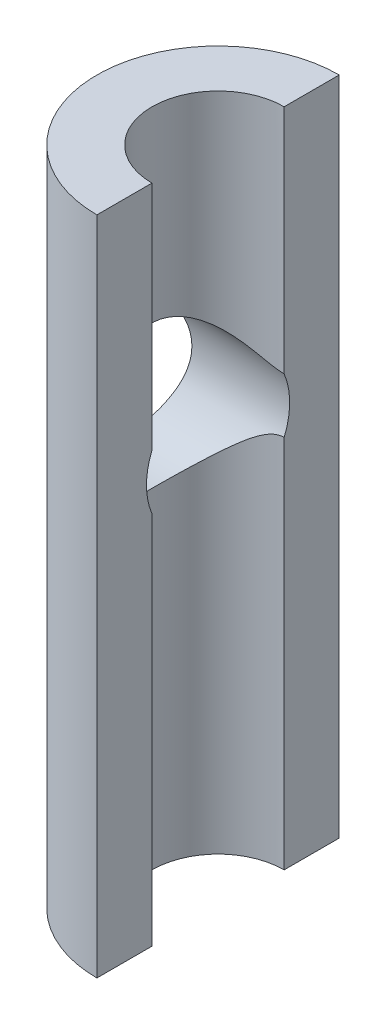
ISO-10303-21;
HEADER;
FILE_DESCRIPTION(('STEP AP214'),'2;1');
FILE_NAME('part.step','',(''),(''),'','','');
FILE_SCHEMA(('AUTOMOTIVE_DESIGN { 1 0 10303 214 1 1 1 1 }'));
ENDSEC;
DATA;
#1=APPLICATION_CONTEXT('core data for automotive mechanical design processes');
#2=APPLICATION_PROTOCOL_DEFINITION('international standard','automotive_design',2000,#1);
#3=PRODUCT_CONTEXT('',#1,'mechanical');
#4=PRODUCT('Part','Part','',(#3));
#5=PRODUCT_RELATED_PRODUCT_CATEGORY('part','',(#4));
#6=PRODUCT_DEFINITION_FORMATION('','',#4);
#7=PRODUCT_DEFINITION_CONTEXT('part definition',#1,'design');
#8=PRODUCT_DEFINITION('design','',#6,#7);
#9=PRODUCT_DEFINITION_SHAPE('','',#8);
#10=(LENGTH_UNIT() NAMED_UNIT(*) SI_UNIT(.MILLI.,.METRE.));
#11=(NAMED_UNIT(*) PLANE_ANGLE_UNIT() SI_UNIT($,.RADIAN.));
#12=(NAMED_UNIT(*) SI_UNIT($,.STERADIAN.) SOLID_ANGLE_UNIT());
#13=UNCERTAINTY_MEASURE_WITH_UNIT(LENGTH_MEASURE(1.E-05),#10,'distance_accuracy_value','');
#14=(GEOMETRIC_REPRESENTATION_CONTEXT(3) GLOBAL_UNCERTAINTY_ASSIGNED_CONTEXT((#13)) GLOBAL_UNIT_ASSIGNED_CONTEXT((#10,
#11,#12)) REPRESENTATION_CONTEXT('',''));
#15=CARTESIAN_POINT('',(0.,0.,0.));
#16=DIRECTION('',(0.,0.,1.));
#17=DIRECTION('',(1.,0.,0.));
#18=AXIS2_PLACEMENT_3D('',#15,#16,#17);
#19=CARTESIAN_POINT('',(0.,30.,0.));
#20=DIRECTION('',(0.,-1.,0.));
#21=DIRECTION('',(0.,0.,-1.));
#22=AXIS2_PLACEMENT_3D('',#19,#20,#21);
#23=CYLINDRICAL_SURFACE('',#22,3.);
#24=CARTESIAN_POINT('',(0.,19.5,-3.));
#25=CARTESIAN_POINT('',(-0.0422091702756363,19.4999561107783,-3.00000888961018));
#26=CARTESIAN_POINT('',(-0.0843697775211311,19.5021387762945,-2.99910906644264));
#27=CARTESIAN_POINT('',(-0.168076763313324,19.5105747096649,-2.99557781827064));
#28=CARTESIAN_POINT('',(-0.209624683164082,19.5168148400897,-2.99295198152648));
#29=CARTESIAN_POINT('',(-0.331317319481589,19.5407458267501,-2.98274435264269));
#30=CARTESIAN_POINT('',(-0.410249045553439,19.563678790974,-2.97282476410644));
#31=CARTESIAN_POINT('',(-0.545677585126842,19.6128005200896,-2.95056215034253));
#32=CARTESIAN_POINT('',(-0.603137565118729,19.6370061575346,-2.93931195617172));
#33=CARTESIAN_POINT('',(-0.715554603753324,19.6894667430439,-2.91398206949702));
#34=CARTESIAN_POINT('',(-0.770510166843171,19.7177240699415,-2.89990071278984));
#35=CARTESIAN_POINT('',(-0.933221348521895,19.8072534489416,-2.8534136621408));
#36=CARTESIAN_POINT('',(-1.0374968430063,19.8727349413293,-2.81699555319946));
#37=CARTESIAN_POINT('',(-1.23136249274118,20.0033098399528,-2.73749328152701));
#38=CARTESIAN_POINT('',(-1.32146876203204,20.0680789554894,-2.69509459985052));
#39=CARTESIAN_POINT('',(-1.49641613692302,20.198945772769,-2.60202959112155));
#40=CARTESIAN_POINT('',(-1.58125344753522,20.2650443877487,-2.55135739821937));
#41=CARTESIAN_POINT('',(-1.74553016085493,20.3963843359193,-2.44188914308438));
#42=CARTESIAN_POINT('',(-1.82498956918576,20.4616280246055,-2.38312597438199));
#43=CARTESIAN_POINT('',(-1.97868431401462,20.5900678146121,-2.25713964231832));
#44=CARTESIAN_POINT('',(-2.0529195197795,20.6532638646699,-2.18991626736175));
#45=CARTESIAN_POINT('',(-2.23059590721411,20.8063915354293,-2.01174381442809));
#46=CARTESIAN_POINT('',(-2.33057692132515,20.8942928686061,-1.89548266746183));
#47=CARTESIAN_POINT('',(-2.51465358380597,21.0578863828034,-1.64340720594622));
#48=CARTESIAN_POINT('',(-2.59876965236987,21.1335942397736,-1.50761842845262));
#49=CARTESIAN_POINT('',(-2.73161025577498,21.253927018472,-1.24704163675329));
#50=CARTESIAN_POINT('',(-2.78405363331609,21.3017421080142,-1.12564218805052));
#51=CARTESIAN_POINT('',(-2.87336186677912,21.3834296876478,-0.872769659432101));
#52=CARTESIAN_POINT('',(-2.91023712307749,21.417311485564,-0.741303374308736));
#53=CARTESIAN_POINT('',(-2.96612092892049,21.4687345477073,-0.470479036822421));
#54=CARTESIAN_POINT('',(-2.98500674566798,21.4861635557865,-0.331073554362935));
#55=CARTESIAN_POINT('',(-3.0028845290718,21.5026608307819,-0.0499226534031328));
#56=CARTESIAN_POINT('',(-3.00188551425977,21.5017374212218,0.091821675196911));
#57=CARTESIAN_POINT('',(-2.98132061431491,21.4827636974861,0.357033228820978));
#58=CARTESIAN_POINT('',(-2.96379421568718,21.4665947184613,0.480806015285573));
#59=CARTESIAN_POINT('',(-2.91423644326417,21.4209904612537,0.722836612298922));
#60=CARTESIAN_POINT('',(-2.88220288070196,21.3915531812205,0.841093587679536));
#61=CARTESIAN_POINT('',(-2.80381980210445,21.3197955777223,1.07441455146283));
#62=CARTESIAN_POINT('',(-2.75693755148849,21.2769968659069,1.18914924648533));
#63=CARTESIAN_POINT('',(-2.65155914587861,21.1813448940983,1.40857350777057));
#64=CARTESIAN_POINT('',(-2.59305680345765,21.1284862780715,1.51325767812214));
#65=CARTESIAN_POINT('',(-2.43306065965346,20.9850341208098,1.76423769016185));
#66=CARTESIAN_POINT('',(-2.32512812193475,20.8892057141028,1.90349990091851));
#67=CARTESIAN_POINT('',(-2.15041018243998,20.73715736704,2.09360747131797));
#68=CARTESIAN_POINT('',(-2.08991895359771,20.6849931718583,2.15393338434525));
#69=CARTESIAN_POINT('',(-1.96501452325585,20.5786698626043,2.26845448935582));
#70=CARTESIAN_POINT('',(-1.90060268771359,20.5245114458966,2.32265179797803));
#71=CARTESIAN_POINT('',(-1.76650276929043,20.4136933096618,2.42627882367062));
#72=CARTESIAN_POINT('',(-1.69672426931795,20.3570048037614,2.47555985807262));
#73=CARTESIAN_POINT('',(-1.55339521237165,20.2433947684355,2.56792339858386));
#74=CARTESIAN_POINT('',(-1.47984567753995,20.1864733059621,2.61100757243486));
#75=CARTESIAN_POINT('',(-1.32874363671065,20.0736030141731,2.69105109054551));
#76=CARTESIAN_POINT('',(-1.25119045051173,20.0176543523044,2.72800938952723));
#77=CARTESIAN_POINT('',(-1.09160772948034,19.9085247641352,2.79569377807575));
#78=CARTESIAN_POINT('',(-1.00958205501444,19.8553415260083,2.82642513756583));
#79=CARTESIAN_POINT('',(-0.84613698225089,19.7581244612335,2.87939181505579));
#80=CARTESIAN_POINT('',(-0.765097097399651,19.7137078545749,2.90207878781017));
#81=CARTESIAN_POINT('',(-0.597881383154987,19.6336962258539,2.9410616539129));
#82=CARTESIAN_POINT('',(-0.511749272118343,19.5980367197322,2.95740481316181));
#83=CARTESIAN_POINT('',(-0.355346711059572,19.5479792153935,2.97965207354081));
#84=CARTESIAN_POINT('',(-0.286334344726789,19.530516379398,2.98713033312349));
#85=CARTESIAN_POINT('',(-0.180618033112293,19.5124928389227,2.99477121994714));
#86=CARTESIAN_POINT('',(-0.144727875050444,19.5078434424587,2.99672291579888));
#87=CARTESIAN_POINT('',(-0.072567253571715,19.5015822117893,2.99934103135357));
#88=CARTESIAN_POINT('',(-0.0362961725416602,19.4999764785779,3.00000486962072));
#89=CARTESIAN_POINT('',(0.,19.5000000000001,3.00000000000001));
#90=B_SPLINE_CURVE_WITH_KNOTS('',3,(#24,#25,#26,#27,#28,#29,#30,#31,#32,#33,#34,#35,#36,#37,#38,
#39,#40,#41,#42,#43,#44,#45,#46,#47,#48,#49,#50,#51,#52,#53,#54,#55,#56,#57,#58,#59,#60,#61,#62,
#63,#64,#65,#66,#67,#68,#69,#70,#71,#72,#73,#74,#75,#76,#77,#78,#79,#80,#81,#82,#83,#84,#85,#86,
#87,#88,#89),.UNSPECIFIED.,.F.,.F.,(4,2,2,2,2,2,2,2,2,2,2,2,2,2,2,2,2,2,2,2,2,2,2,2,2,2,2,2,2,2,
2,2,4),(0.,0.126478985406031,0.252550477515914,0.499575089074278,0.689406729563249,
0.879350284133531,1.26354872050493,1.61954737675188,1.97579953787245,2.33064393316765,
2.68549720511734,3.21379759610369,3.74141328646166,4.1616126865089,4.58153092392307,
5.00429395333211,5.42686524790874,5.80329015155237,6.17977186719655,6.57167738218553,
6.96379213984148,7.5619173659576,7.86201633707895,8.16201134426466,8.4693297311549,
8.77656525502467,9.0838531496407,9.3908798870197,9.67585710281417,9.9586682986821,
10.1724695903703,10.2810559030246,10.38985964667),.UNSPECIFIED.);
#91=CARTESIAN_POINT('',(0.,19.5,-3.));
#92=VERTEX_POINT('',#91);
#93=CARTESIAN_POINT('',(0.,19.5,3.));
#94=VERTEX_POINT('',#93);
#95=EDGE_CURVE('E11',#92,#94,#90,.T.);
#96=ORIENTED_EDGE('',*,*,#95,.F.);
#97=DIRECTION('',(0.,-1.,0.));
#98=VECTOR('',#97,1.);
#99=CARTESIAN_POINT('',(0.,30.,-3.));
#100=LINE('',#99,#98);
#101=CARTESIAN_POINT('',(0.,30.,-3.));
#102=VERTEX_POINT('',#101);
#103=EDGE_CURVE('E71',#102,#92,#100,.T.);
#104=ORIENTED_EDGE('',*,*,#103,.F.);
#105=CARTESIAN_POINT('',(0.,30.,0.));
#106=DIRECTION('',(0.,1.,0.));
#107=DIRECTION('',(0.,0.,1.));
#108=AXIS2_PLACEMENT_3D('',#105,#106,#107);
#109=CIRCLE('',#108,3.);
#110=CARTESIAN_POINT('',(0.,30.,3.));
#111=VERTEX_POINT('',#110);
#112=EDGE_CURVE('E121',#102,#111,#109,.T.);
#113=ORIENTED_EDGE('',*,*,#112,.T.);
#114=DIRECTION('',(0.,-1.,0.));
#115=VECTOR('',#114,1.);
#116=CARTESIAN_POINT('',(0.,30.,3.));
#117=LINE('',#116,#115);
#118=EDGE_CURVE('E131',#111,#94,#117,.T.);
#119=ORIENTED_EDGE('',*,*,#118,.T.);
#120=EDGE_LOOP('',(#96,#104,#113,#119));
#121=FACE_BOUND('',#120,.T.);
#122=ADVANCED_FACE('F41',(#121),#23,.F.);
#123=CARTESIAN_POINT('',(0.,30.,0.));
#124=DIRECTION('',(1.,0.,0.));
#125=DIRECTION('',(0.,0.,-1.));
#126=AXIS2_PLACEMENT_3D('',#123,#124,#125);
#127=PLANE('',#126);
#128=CARTESIAN_POINT('',(0.,18.25,0.));
#129=DIRECTION('',(1.,0.,0.));
#130=DIRECTION('',(0.,0.,-1.));
#131=AXIS2_PLACEMENT_3D('',#128,#129,#130);
#132=CIRCLE('',#131,3.25);
#133=CARTESIAN_POINT('',(0.,17.,-3.));
#134=VERTEX_POINT('',#133);
#135=EDGE_CURVE('E109',#134,#92,#132,.T.);
#136=ORIENTED_EDGE('',*,*,#135,.F.);
#137=CARTESIAN_POINT('',(0.,0.,-3.));
#138=VERTEX_POINT('',#137);
#139=EDGE_CURVE('E94',#134,#138,#100,.T.);
#140=ORIENTED_EDGE('',*,*,#139,.T.);
#141=DIRECTION('',(0.,0.,1.));
#142=VECTOR('',#141,1.);
#143=CARTESIAN_POINT('',(0.,0.,0.));
#144=LINE('',#143,#142);
#145=CARTESIAN_POINT('',(0.,0.,-5.5));
#146=VERTEX_POINT('',#145);
#147=EDGE_CURVE('E160',#146,#138,#144,.T.);
#148=ORIENTED_EDGE('',*,*,#147,.F.);
#149=DIRECTION('',(0.,-1.,0.));
#150=VECTOR('',#149,1.);
#151=CARTESIAN_POINT('',(0.,30.,-5.5));
#152=LINE('',#151,#150);
#153=CARTESIAN_POINT('',(0.,30.,-5.5));
#154=VERTEX_POINT('',#153);
#155=EDGE_CURVE('E98',#154,#146,#152,.T.);
#156=ORIENTED_EDGE('',*,*,#155,.F.);
#157=DIRECTION('',(0.,0.,1.));
#158=VECTOR('',#157,1.);
#159=CARTESIAN_POINT('',(0.,30.,0.));
#160=LINE('',#159,#158);
#161=EDGE_CURVE('E162',#154,#102,#160,.T.);
#162=ORIENTED_EDGE('',*,*,#161,.T.);
#163=ORIENTED_EDGE('',*,*,#103,.T.);
#164=EDGE_LOOP('',(#136,#140,#148,#156,#162,#163));
#165=FACE_BOUND('',#164,.T.);
#166=ADVANCED_FACE('F43',(#165),#127,.T.);
#167=CARTESIAN_POINT('',(0.,30.,0.));
#168=DIRECTION('',(0.,-1.,0.));
#169=DIRECTION('',(0.,0.,-1.));
#170=AXIS2_PLACEMENT_3D('',#167,#168,#169);
#171=CYLINDRICAL_SURFACE('',#170,5.5);
#172=CARTESIAN_POINT('',(-5.5,15.,0.));
#173=CARTESIAN_POINT('',(-5.49999936751364,15.0000006926879,-0.0833686342938197));
#174=CARTESIAN_POINT('',(-5.49809935675368,15.0032132353779,-0.166764530401117));
#175=CARTESIAN_POINT('',(-5.49054506200043,15.0160224454611,-0.332929223961618));
#176=CARTESIAN_POINT('',(-5.48488837986077,15.0256231908989,-0.415697586657911));
#177=CARTESIAN_POINT('',(-5.46994469255171,15.0511091331978,-0.580109814449852));
#178=CARTESIAN_POINT('',(-5.46065023793302,15.0670072266107,-0.661751013880572));
#179=CARTESIAN_POINT('',(-5.43866389500503,15.1048770534718,-0.823156877609972));
#180=CARTESIAN_POINT('',(-5.42597054685625,15.1268513968283,-0.902920719523134));
#181=CARTESIAN_POINT('',(-5.3833710030438,15.2012523779745,-1.13773523003822));
#182=CARTESIAN_POINT('',(-5.34884832870976,15.2623169474281,-1.28931583074348));
#183=CARTESIAN_POINT('',(-5.27045845654917,15.4050441467081,-1.57953818311456));
#184=CARTESIAN_POINT('',(-5.22659405658125,15.4867006105812,-1.71818379098707));
#185=CARTESIAN_POINT('',(-5.12935536766012,15.6751606909425,-1.99051108578382));
#186=CARTESIAN_POINT('',(-5.07551406364624,15.7833932774594,-2.12303609188623));
#187=CARTESIAN_POINT('',(-4.96540292609368,16.0187333769609,-2.36917785466069));
#188=CARTESIAN_POINT('',(-4.90913010095652,16.1458646395169,-2.48277043275171));
#189=CARTESIAN_POINT('',(-4.7926403408896,16.4330930516919,-2.70142042801642));
#190=CARTESIAN_POINT('',(-4.7327423848269,16.595310266006,-2.8038858502766));
#191=CARTESIAN_POINT('',(-4.62408365644691,16.9381776157295,-2.9796948973738));
#192=CARTESIAN_POINT('',(-4.57530519254142,17.1187977991508,-3.05308492168104));
#193=CARTESIAN_POINT('',(-4.5064184380279,17.4499925555708,-3.15356876068913));
#194=CARTESIAN_POINT('',(-4.48226631543234,17.5976518373784,-3.18748949165174));
#195=CARTESIAN_POINT('',(-4.44852737890894,17.8978202975883,-3.23442018582419));
#196=CARTESIAN_POINT('',(-4.43892329152926,18.0503235044986,-3.24745494882663));
#197=CARTESIAN_POINT('',(-4.43568990651217,18.3560844008005,-3.25187121614261));
#198=CARTESIAN_POINT('',(-4.44208865440188,18.5093429443237,-3.24321470569117));
#199=CARTESIAN_POINT('',(-4.46994159025405,18.8118045281477,-3.20470874888791));
#200=CARTESIAN_POINT('',(-4.49140680288836,18.9610045155618,-3.17484378336187));
#201=CARTESIAN_POINT('',(-4.54619249815638,19.2501944292727,-3.09586588891841));
#202=CARTESIAN_POINT('',(-4.57939489484726,19.390260204472,-3.04694420426161));
#203=CARTESIAN_POINT('',(-4.6540670056515,19.6605864528698,-2.93161593618819));
#204=CARTESIAN_POINT('',(-4.69553979231453,19.7908432570665,-2.86520285155575));
#205=CARTESIAN_POINT('',(-4.79062113030046,20.0614172984147,-2.70372507705699));
#206=CARTESIAN_POINT('',(-4.8450936762755,20.199671339799,-2.6057073538056));
#207=CARTESIAN_POINT('',(-4.95520459229728,20.4591561556151,-2.38970593906771));
#208=CARTESIAN_POINT('',(-5.01084399859294,20.5803709926978,-2.27170377988004));
#209=CARTESIAN_POINT('',(-5.12563927121358,20.8184512874234,-2.00053312291126));
#210=CARTESIAN_POINT('',(-5.18430284108354,20.9326729314503,-1.84478359428561));
#211=CARTESIAN_POINT('',(-5.26407557825946,21.0828014838993,-1.59598018005765));
#212=CARTESIAN_POINT('',(-5.28930500704412,21.1293255750876,-1.51047637122914));
#213=CARTESIAN_POINT('',(-5.33632055782217,21.2148098303167,-1.33488500897749));
#214=CARTESIAN_POINT('',(-5.3581087870047,21.2537746265917,-1.24480030565732));
#215=CARTESIAN_POINT('',(-5.3962945356931,21.3213545559005,-1.06665933501847));
#216=CARTESIAN_POINT('',(-5.41295005681386,21.3504770901486,-0.978850546261458));
#217=CARTESIAN_POINT('',(-5.44218660725737,21.401242032989,-0.800477420065295));
#218=CARTESIAN_POINT('',(-5.45476988980315,21.4228885785909,-0.709914636900113));
#219=CARTESIAN_POINT('',(-5.47548444852861,21.4583699086131,-0.526831146095752));
#220=CARTESIAN_POINT('',(-5.4836187407859,21.472209985426,-0.434311809155615));
#221=CARTESIAN_POINT('',(-5.49519091217993,21.4918646889515,-0.248138631917229));
#222=CARTESIAN_POINT('',(-5.49862940597351,21.4976803660193,-0.154484941719596));
#223=CARTESIAN_POINT('',(-5.50056379065291,21.5009541921818,0.0206896924269897));
#224=CARTESIAN_POINT('',(-5.49965012866562,21.49941071252,0.10218675140681));
#225=CARTESIAN_POINT('',(-5.49422890837552,21.490225354165,0.264724314327143));
#226=CARTESIAN_POINT('',(-5.48972017617189,21.482581483506,0.345764660430808));
#227=CARTESIAN_POINT('',(-5.4709340736482,21.4506178408866,0.587212891418657));
#228=CARTESIAN_POINT('',(-5.4513984980022,21.4172691775134,0.746132341740556));
#229=CARTESIAN_POINT('',(-5.40059701951449,21.3289943447032,1.0522555735999));
#230=CARTESIAN_POINT('',(-5.36956755048644,21.2745021010056,1.19962749810516));
#231=CARTESIAN_POINT('',(-5.29826225414573,21.1460209112318,1.48317090358692));
#232=CARTESIAN_POINT('',(-5.25798448371472,21.0720278674482,1.61934002261502));
#233=CARTESIAN_POINT('',(-5.16657175814559,20.8980204724214,1.89190341639758));
#234=CARTESIAN_POINT('',(-5.11474286048029,20.7960983256513,2.02684330068622));
#235=CARTESIAN_POINT('',(-5.00760526535814,20.5733915413074,2.27874243419958));
#236=CARTESIAN_POINT('',(-4.95229255400849,20.4525848994113,2.39568038794351));
#237=CARTESIAN_POINT('',(-4.83602405259661,20.1779554567196,2.62319164715283));
#238=CARTESIAN_POINT('',(-4.77522298431948,20.0218947046611,2.73116031709344));
#239=CARTESIAN_POINT('',(-4.6625833998787,19.6909217613408,2.91930962501002));
#240=CARTESIAN_POINT('',(-4.61073454044587,19.51603170987,2.99952244085876));
#241=CARTESIAN_POINT('',(-4.53351350848692,19.1904939486289,3.11464115589425));
#242=CARTESIAN_POINT('',(-4.50484109163144,19.0427738513506,3.15559182958112));
#243=CARTESIAN_POINT('',(-4.46167160721966,18.7411070758424,3.21635056854442));
#244=CARTESIAN_POINT('',(-4.4471559706869,18.5871688306742,3.23618633267743));
#245=CARTESIAN_POINT('',(-4.43442649297471,18.2768464476966,3.25361282095894));
#246=CARTESIAN_POINT('',(-4.43626401283575,18.1204561448218,3.25113345878311));
#247=CARTESIAN_POINT('',(-4.45607313483243,17.8106326093923,3.22392175519534));
#248=CARTESIAN_POINT('',(-4.47405418333932,17.657201161911,3.19917638482991));
#249=CARTESIAN_POINT('',(-4.52256116904837,17.3632338067638,3.13019310203328));
#250=CARTESIAN_POINT('',(-4.55258937833032,17.2224298818656,3.08672404464625));
#251=CARTESIAN_POINT('',(-4.62172005259197,16.949920330678,2.98221708932646));
#252=CARTESIAN_POINT('',(-4.66082592297552,16.8182181429461,2.92117259605488));
#253=CARTESIAN_POINT('',(-4.75106422467903,16.5458571721929,2.77237395243954));
#254=CARTESIAN_POINT('',(-4.80312127923156,16.4069649451176,2.68194868322038));
#255=CARTESIAN_POINT('',(-4.9096125507394,16.1449724330053,2.48165486653074));
#256=CARTESIAN_POINT('',(-4.96404865807285,16.0218850238011,2.37177063748607));
#257=CARTESIAN_POINT('',(-5.07886457762142,15.7759515235207,2.11601882697373));
#258=CARTESIAN_POINT('',(-5.13890491780294,15.6559333113202,1.96722437659066));
#259=CARTESIAN_POINT('',(-5.22206900587385,15.4959925301392,1.72834160784627));
#260=CARTESIAN_POINT('',(-5.24865975346579,15.4459942653971,1.64602558070938));
#261=CARTESIAN_POINT('',(-5.29882001144604,15.3531874262878,1.47658080377645));
#262=CARTESIAN_POINT('',(-5.32239125855567,15.3103747145818,1.38945486213459));
#263=CARTESIAN_POINT('',(-5.36496376614874,15.2339927250268,1.21447590212391));
#264=CARTESIAN_POINT('',(-5.3841090665078,15.2001244753273,1.1267883934213));
#265=CARTESIAN_POINT('',(-5.41842079100955,15.1399525282822,0.948145023926232));
#266=CARTESIAN_POINT('',(-5.43358953405603,15.1136444214232,0.857191103265468));
#267=CARTESIAN_POINT('',(-5.45945764263522,15.0690399463965,0.673012567145493));
#268=CARTESIAN_POINT('',(-5.47017031080937,15.0507197241284,0.579795602319771));
#269=CARTESIAN_POINT('',(-5.48684100659077,15.022298324209,0.391751109078144));
#270=CARTESIAN_POINT('',(-5.49280315257229,15.0121900272369,0.296925048645322));
#271=CARTESIAN_POINT('',(-5.49753007162861,15.0041814159415,0.168214593540197));
#272=CARTESIAN_POINT('',(-5.49845570735289,15.0026140108944,0.134599519629898));
#273=CARTESIAN_POINT('',(-5.49969080522128,15.0005231529325,0.0673244461229648));
#274=CARTESIAN_POINT('',(-5.50000025539944,14.999999720291,0.0336644456665862));
#275=CARTESIAN_POINT('',(-5.5,15.,0.));
#276=B_SPLINE_CURVE_WITH_KNOTS('',3,(#172,#173,#174,#175,#176,#177,#178,#179,#180,#181,#182,
#183,#184,#185,#186,#187,#188,#189,#190,#191,#192,#193,#194,#195,#196,#197,#198,#199,#200,#201,
#202,#203,#204,#205,#206,#207,#208,#209,#210,#211,#212,#213,#214,#215,#216,#217,#218,#219,#220,
#221,#222,#223,#224,#225,#226,#227,#228,#229,#230,#231,#232,#233,#234,#235,#236,#237,#238,#239,
#240,#241,#242,#243,#244,#245,#246,#247,#248,#249,#250,#251,#252,#253,#254,#255,#256,#257,#258,
#259,#260,#261,#262,#263,#264,#265,#266,#267,#268,#269,#270,#271,#272,#273,#274,#275),
.UNSPECIFIED.,.T.,.F.,(4,2,2,2,2,2,2,2,2,2,2,2,2,2,2,2,2,2,2,2,2,2,2,2,2,2,2,2,2,2,2,2,2,2,2,2,
2,2,2,2,2,2,2,2,2,2,2,2,2,2,2,4),(0.,0.2500697705534,0.500299331796072,0.751044018275922,
1.00189657390926,1.50056846850607,1.99909121975245,2.53509028027298,3.07176870472921,
3.67182350067391,4.27091681464016,4.72920943749463,5.18695748386979,5.64550831162603,
6.10439502772024,6.5587905312253,7.01335516369941,7.54531582525217,8.07777078339378,
8.67988699924907,8.98120077395419,9.28232932034813,9.56392439860218,9.84536339914566,
10.1266113681812,10.4078225197157,10.6520575983989,10.8963724600106,11.3844563956151,
11.8630123788593,12.3416690014685,12.8701910407153,13.3993335715036,13.9943494154759,
14.5886731171539,15.0545732449924,15.5198614419859,15.9866115035,16.4536348615261,
16.9030773331062,17.3526886822925,17.8718581969698,18.3914480195975,18.9892862539487,
19.2886921582344,19.5879250730112,19.8753048336053,20.1625166358771,20.448864767345,
20.7349643838569,20.8359411696526,20.9369199163355),.UNSPECIFIED.);
#277=CARTESIAN_POINT('',(-5.5,15.,0.));
#278=VERTEX_POINT('',#277);
#279=EDGE_CURVE('E114',#278,#278,#276,.T.);
#280=ORIENTED_EDGE('',*,*,#279,.T.);
#281=EDGE_LOOP('',(#280));
#282=FACE_BOUND('',#281,.T.);
#283=CARTESIAN_POINT('',(0.,0.,0.));
#284=DIRECTION('',(0.,1.,0.));
#285=DIRECTION('',(0.,0.,1.));
#286=AXIS2_PLACEMENT_3D('',#283,#284,#285);
#287=CIRCLE('',#286,5.5);
#288=CARTESIAN_POINT('',(0.,0.,5.5));
#289=VERTEX_POINT('',#288);
#290=EDGE_CURVE('E184',#146,#289,#287,.T.);
#291=ORIENTED_EDGE('',*,*,#290,.T.);
#292=DIRECTION('',(0.,-1.,0.));
#293=VECTOR('',#292,1.);
#294=CARTESIAN_POINT('',(0.,30.,5.5));
#295=LINE('',#294,#293);
#296=CARTESIAN_POINT('',(0.,30.,5.5));
#297=VERTEX_POINT('',#296);
#298=EDGE_CURVE('E135',#297,#289,#295,.T.);
#299=ORIENTED_EDGE('',*,*,#298,.F.);
#300=CARTESIAN_POINT('',(0.,30.,0.));
#301=DIRECTION('',(0.,1.,0.));
#302=DIRECTION('',(0.,0.,1.));
#303=AXIS2_PLACEMENT_3D('',#300,#301,#302);
#304=CIRCLE('',#303,5.5);
#305=EDGE_CURVE('E194',#154,#297,#304,.T.);
#306=ORIENTED_EDGE('',*,*,#305,.F.);
#307=ORIENTED_EDGE('',*,*,#155,.T.);
#308=EDGE_LOOP('',(#291,#299,#306,#307));
#309=FACE_BOUND('',#308,.T.);
#310=ADVANCED_FACE('F164',(#282,#309),#171,.T.);
#311=CARTESIAN_POINT('',(0.,30.,0.));
#312=DIRECTION('',(1.,0.,0.));
#313=DIRECTION('',(0.,0.,-1.));
#314=AXIS2_PLACEMENT_3D('',#311,#312,#313);
#315=PLANE('',#314);
#316=CARTESIAN_POINT('',(0.,18.25,0.));
#317=DIRECTION('',(1.,0.,0.));
#318=DIRECTION('',(0.,0.,-1.));
#319=AXIS2_PLACEMENT_3D('',#316,#317,#318);
#320=CIRCLE('',#319,3.25);
#321=CARTESIAN_POINT('',(0.,17.,3.));
#322=VERTEX_POINT('',#321);
#323=EDGE_CURVE('E62',#94,#322,#320,.T.);
#324=ORIENTED_EDGE('',*,*,#323,.F.);
#325=ORIENTED_EDGE('',*,*,#118,.F.);
#326=DIRECTION('',(0.,0.,1.));
#327=VECTOR('',#326,1.);
#328=CARTESIAN_POINT('',(0.,30.,0.));
#329=LINE('',#328,#327);
#330=EDGE_CURVE('E126',#111,#297,#329,.T.);
#331=ORIENTED_EDGE('',*,*,#330,.T.);
#332=ORIENTED_EDGE('',*,*,#298,.T.);
#333=DIRECTION('',(0.,0.,1.));
#334=VECTOR('',#333,1.);
#335=CARTESIAN_POINT('',(0.,0.,0.));
#336=LINE('',#335,#334);
#337=CARTESIAN_POINT('',(0.,0.,3.));
#338=VERTEX_POINT('',#337);
#339=EDGE_CURVE('E188',#338,#289,#336,.T.);
#340=ORIENTED_EDGE('',*,*,#339,.F.);
#341=EDGE_CURVE('E125',#322,#338,#117,.T.);
#342=ORIENTED_EDGE('',*,*,#341,.F.);
#343=EDGE_LOOP('',(#324,#325,#331,#332,#340,#342));
#344=FACE_BOUND('',#343,.T.);
#345=ADVANCED_FACE('F167',(#344),#315,.T.);
#346=CARTESIAN_POINT('',(0.,17.,3.));
#347=CARTESIAN_POINT('',(-0.0422091702756386,17.0000438892217,3.00000888961018));
#348=CARTESIAN_POINT('',(-0.0843697775211333,16.9978612237055,2.99910906644264));
#349=CARTESIAN_POINT('',(-0.168076763313326,16.9894252903352,2.99557781827064));
#350=CARTESIAN_POINT('',(-0.209624683164084,16.9831851599103,2.99295198152648));
#351=CARTESIAN_POINT('',(-0.331317319481591,16.9592541732499,2.98274435264269));
#352=CARTESIAN_POINT('',(-0.410249045553441,16.936321209026,2.97282476410644));
#353=CARTESIAN_POINT('',(-0.545677585126844,16.8871994799104,2.95056215034253));
#354=CARTESIAN_POINT('',(-0.603137565118731,16.8629938424654,2.93931195617172));
#355=CARTESIAN_POINT('',(-0.715554603753327,16.8105332569561,2.91398206949702));
#356=CARTESIAN_POINT('',(-0.770510166843175,16.7822759300585,2.89990071278984));
#357=CARTESIAN_POINT('',(-0.9332213485219,16.6927465510584,2.85341366214079));
#358=CARTESIAN_POINT('',(-1.0374968430063,16.6272650586707,2.81699555319946));
#359=CARTESIAN_POINT('',(-1.23136249274119,16.4966901600472,2.73749328152701));
#360=CARTESIAN_POINT('',(-1.32146876203204,16.4319210445106,2.69509459985052));
#361=CARTESIAN_POINT('',(-1.49641613692302,16.301054227231,2.60202959112154));
#362=CARTESIAN_POINT('',(-1.58125344753523,16.2349556122513,2.55135739821937));
#363=CARTESIAN_POINT('',(-1.74553016085493,16.1036156640807,2.44188914308437));
#364=CARTESIAN_POINT('',(-1.82498956918576,16.0383719753945,2.38312597438199));
#365=CARTESIAN_POINT('',(-1.97868431401463,15.9099321853879,2.25713964231831));
#366=CARTESIAN_POINT('',(-2.05291951977951,15.84673613533,2.18991626736174));
#367=CARTESIAN_POINT('',(-2.23059590721412,15.6936084645707,2.01174381442808));
#368=CARTESIAN_POINT('',(-2.33057692132515,15.6057071313939,1.89548266746182));
#369=CARTESIAN_POINT('',(-2.51465358380598,15.4421136171966,1.64340720594622));
#370=CARTESIAN_POINT('',(-2.59876965236987,15.3664057602264,1.50761842845261));
#371=CARTESIAN_POINT('',(-2.73161025577498,15.246072981528,1.24704163675328));
#372=CARTESIAN_POINT('',(-2.78405363331609,15.1982578919858,1.12564218805052));
#373=CARTESIAN_POINT('',(-2.87336186677912,15.1165703123522,0.872769659432096));
#374=CARTESIAN_POINT('',(-2.91023712307749,15.082688514436,0.741303374308731));
#375=CARTESIAN_POINT('',(-2.9661209289205,15.0312654522927,0.470479036822416));
#376=CARTESIAN_POINT('',(-2.98500674566799,15.0138364442135,0.33107355436293));
#377=CARTESIAN_POINT('',(-3.0028845290718,14.9973391692181,0.0499226534031283));
#378=CARTESIAN_POINT('',(-3.00188551425977,14.9982625787782,-0.0918216751969152));
#379=CARTESIAN_POINT('',(-2.98132061431491,15.0172363025139,-0.357033228820982));
#380=CARTESIAN_POINT('',(-2.96379421568718,15.0334052815387,-0.480806015285576));
#381=CARTESIAN_POINT('',(-2.91423644326417,15.0790095387463,-0.722836612298925));
#382=CARTESIAN_POINT('',(-2.88220288070196,15.1084468187795,-0.841093587679539));
#383=CARTESIAN_POINT('',(-2.80381980210445,15.1802044222777,-1.07441455146283));
#384=CARTESIAN_POINT('',(-2.75693755148848,15.2230031340931,-1.18914924648533));
#385=CARTESIAN_POINT('',(-2.65155914587861,15.3186551059017,-1.40857350777057));
#386=CARTESIAN_POINT('',(-2.59305680345765,15.3715137219285,-1.51325767812214));
#387=CARTESIAN_POINT('',(-2.43306065965346,15.5149658791902,-1.76423769016186));
#388=CARTESIAN_POINT('',(-2.32512812193475,15.6107942858972,-1.90349990091852));
#389=CARTESIAN_POINT('',(-2.15041018243997,15.76284263296,-2.09360747131797));
#390=CARTESIAN_POINT('',(-2.08991895359771,15.8150068281417,-2.15393338434525));
#391=CARTESIAN_POINT('',(-1.96501452325585,15.9213301373957,-2.26845448935582));
#392=CARTESIAN_POINT('',(-1.90060268771359,15.9754885541034,-2.32265179797803));
#393=CARTESIAN_POINT('',(-1.76650276929043,16.0863066903382,-2.42627882367062));
#394=CARTESIAN_POINT('',(-1.69672426931794,16.1429951962386,-2.47555985807262));
#395=CARTESIAN_POINT('',(-1.55339521237165,16.2566052315645,-2.56792339858386));
#396=CARTESIAN_POINT('',(-1.47984567753995,16.3135266940379,-2.61100757243486));
#397=CARTESIAN_POINT('',(-1.32874363671065,16.4263969858269,-2.69105109054551));
#398=CARTESIAN_POINT('',(-1.25119045051172,16.4823456476956,-2.72800938952723));
#399=CARTESIAN_POINT('',(-1.09160772948034,16.5914752358648,-2.79569377807575));
#400=CARTESIAN_POINT('',(-1.00958205501443,16.6446584739917,-2.82642513756583));
#401=CARTESIAN_POINT('',(-0.846136982250885,16.7418755387665,-2.87939181505579));
#402=CARTESIAN_POINT('',(-0.765097097399645,16.7862921454251,-2.90207878781018));
#403=CARTESIAN_POINT('',(-0.597881383154981,16.8663037741461,-2.94106165391291));
#404=CARTESIAN_POINT('',(-0.511749272118337,16.9019632802678,-2.95740481316181));
#405=CARTESIAN_POINT('',(-0.355346711059566,16.9520207846065,-2.97965207354081));
#406=CARTESIAN_POINT('',(-0.286334344726783,16.969483620602,-2.98713033312349));
#407=CARTESIAN_POINT('',(-0.180618033112289,16.9875071610773,-2.99477121994714));
#408=CARTESIAN_POINT('',(-0.14472787505044,16.9921565575413,-2.99672291579888));
#409=CARTESIAN_POINT('',(-0.0725672535717111,16.9984177882107,-2.99934103135357));
#410=CARTESIAN_POINT('',(-0.0362961725416567,17.0000235214221,-3.00000486962072));
#411=CARTESIAN_POINT('',(0.,16.9999999999999,-3.00000000000001));
#412=B_SPLINE_CURVE_WITH_KNOTS('',3,(#346,#347,#348,#349,#350,#351,#352,#353,#354,#355,#356,
#357,#358,#359,#360,#361,#362,#363,#364,#365,#366,#367,#368,#369,#370,#371,#372,#373,#374,#375,
#376,#377,#378,#379,#380,#381,#382,#383,#384,#385,#386,#387,#388,#389,#390,#391,#392,#393,#394,
#395,#396,#397,#398,#399,#400,#401,#402,#403,#404,#405,#406,#407,#408,#409,#410,#411),
.UNSPECIFIED.,.F.,.F.,(4,2,2,2,2,2,2,2,2,2,2,2,2,2,2,2,2,2,2,2,2,2,2,2,2,2,2,2,2,2,2,2,4),(0.,
0.126478985406031,0.252550477515913,0.499575089074278,0.689406729563248,0.879350284133535,
1.26354872050493,1.61954737675189,1.97579953787246,2.33064393316766,2.68549720511735,
3.2137975961037,3.74141328646167,4.1616126865089,4.58153092392308,5.00429395333211,
5.42686524790874,5.80329015155238,6.17977186719655,6.57167738218553,6.96379213984148,
7.5619173659576,7.86201633707895,8.16201134426467,8.4693297311549,8.77656525502467,
9.0838531496407,9.3908798870197,9.67585710281418,9.9586682986821,10.1724695903703,
10.2810559030246,10.38985964667),.UNSPECIFIED.);
#413=EDGE_CURVE('E56',#322,#134,#412,.T.);
#414=ORIENTED_EDGE('',*,*,#413,.F.);
#415=ORIENTED_EDGE('',*,*,#341,.T.);
#416=CARTESIAN_POINT('',(0.,0.,0.));
#417=DIRECTION('',(0.,1.,0.));
#418=DIRECTION('',(0.,0.,1.));
#419=AXIS2_PLACEMENT_3D('',#416,#417,#418);
#420=CIRCLE('',#419,3.);
#421=EDGE_CURVE('E119',#138,#338,#420,.T.);
#422=ORIENTED_EDGE('',*,*,#421,.F.);
#423=ORIENTED_EDGE('',*,*,#139,.F.);
#424=EDGE_LOOP('',(#414,#415,#422,#423));
#425=FACE_BOUND('',#424,.T.);
#426=ADVANCED_FACE('F117',(#425),#23,.F.);
#427=CARTESIAN_POINT('',(0.,30.,0.));
#428=DIRECTION('',(0.,1.,0.));
#429=DIRECTION('',(0.,0.,1.));
#430=AXIS2_PLACEMENT_3D('',#427,#428,#429);
#431=PLANE('',#430);
#432=ORIENTED_EDGE('',*,*,#161,.F.);
#433=ORIENTED_EDGE('',*,*,#305,.T.);
#434=ORIENTED_EDGE('',*,*,#330,.F.);
#435=ORIENTED_EDGE('',*,*,#112,.F.);
#436=EDGE_LOOP('',(#432,#433,#434,#435));
#437=FACE_BOUND('',#436,.T.);
#438=ADVANCED_FACE('F150',(#437),#431,.T.);
#439=CARTESIAN_POINT('',(0.,0.,0.));
#440=DIRECTION('',(0.,1.,0.));
#441=DIRECTION('',(0.,0.,1.));
#442=AXIS2_PLACEMENT_3D('',#439,#440,#441);
#443=PLANE('',#442);
#444=ORIENTED_EDGE('',*,*,#147,.T.);
#445=ORIENTED_EDGE('',*,*,#421,.T.);
#446=ORIENTED_EDGE('',*,*,#339,.T.);
#447=ORIENTED_EDGE('',*,*,#290,.F.);
#448=EDGE_LOOP('',(#444,#445,#446,#447));
#449=FACE_BOUND('',#448,.T.);
#450=ADVANCED_FACE('F149',(#449),#443,.F.);
#451=CARTESIAN_POINT('',(-5.5,18.25,0.));
#452=DIRECTION('',(1.,0.,0.));
#453=DIRECTION('',(0.,0.,-1.));
#454=AXIS2_PLACEMENT_3D('',#451,#452,#453);
#455=CYLINDRICAL_SURFACE('',#454,3.25);
#456=ORIENTED_EDGE('',*,*,#95,.T.);
#457=ORIENTED_EDGE('',*,*,#323,.T.);
#458=ORIENTED_EDGE('',*,*,#413,.T.);
#459=ORIENTED_EDGE('',*,*,#135,.T.);
#460=EDGE_LOOP('',(#456,#457,#458,#459));
#461=FACE_BOUND('',#460,.T.);
#462=ORIENTED_EDGE('',*,*,#279,.F.);
#463=EDGE_LOOP('',(#462));
#464=FACE_BOUND('',#463,.T.);
#465=ADVANCED_FACE('F107',(#461,#464),#455,.F.);
#466=CLOSED_SHELL('',(#122,#166,#310,#345,#426,#438,#450,#465));
#467=MANIFOLD_SOLID_BREP('B2',#466);
#468=ADVANCED_BREP_SHAPE_REPRESENTATION('',(#18,#467),#14);
#469=SHAPE_DEFINITION_REPRESENTATION(#9,#468);
ENDSEC;
END-ISO-10303-21;
